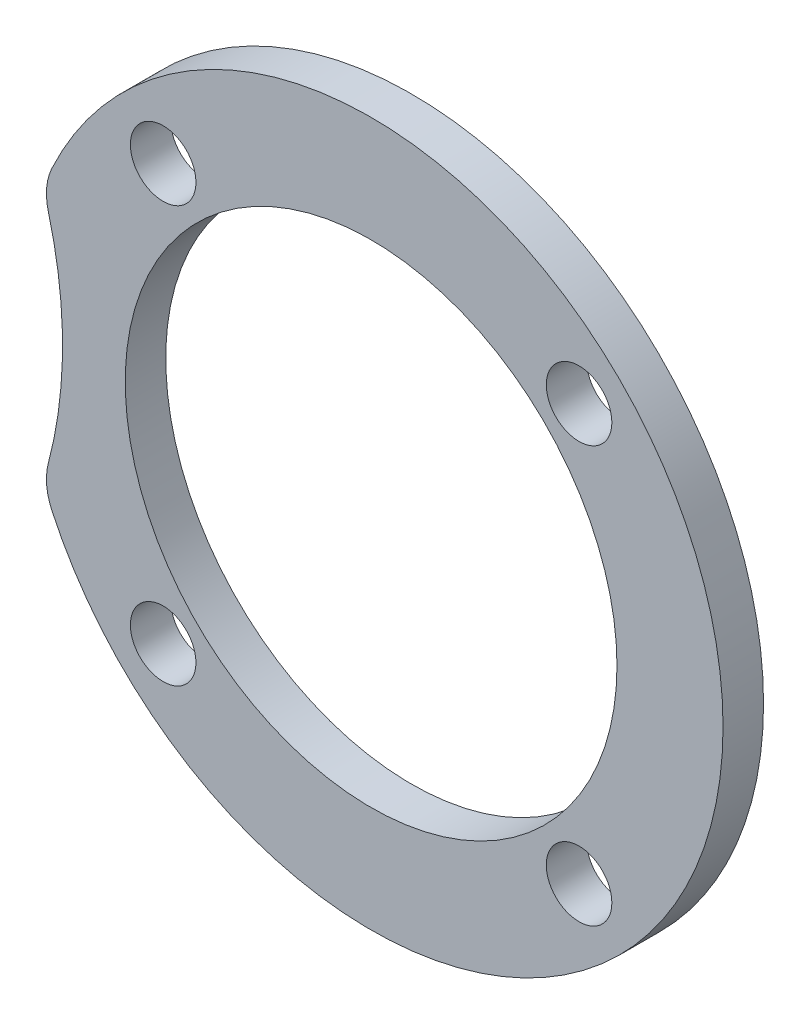
ISO-10303-21;
HEADER;
FILE_DESCRIPTION(('STEP AP214'),'2;1');
FILE_NAME('part.step','',(''),(''),'','','');
FILE_SCHEMA(('AUTOMOTIVE_DESIGN { 1 0 10303 214 1 1 1 1 }'));
ENDSEC;
DATA;
#1=APPLICATION_CONTEXT('core data for automotive mechanical design processes');
#2=APPLICATION_PROTOCOL_DEFINITION('international standard','automotive_design',2000,#1);
#3=PRODUCT_CONTEXT('',#1,'mechanical');
#4=PRODUCT('Part','Part','',(#3));
#5=PRODUCT_RELATED_PRODUCT_CATEGORY('part','',(#4));
#6=PRODUCT_DEFINITION_FORMATION('','',#4);
#7=PRODUCT_DEFINITION_CONTEXT('part definition',#1,'design');
#8=PRODUCT_DEFINITION('design','',#6,#7);
#9=PRODUCT_DEFINITION_SHAPE('','',#8);
#10=(LENGTH_UNIT() NAMED_UNIT(*) SI_UNIT(.MILLI.,.METRE.));
#11=(NAMED_UNIT(*) PLANE_ANGLE_UNIT() SI_UNIT($,.RADIAN.));
#12=(NAMED_UNIT(*) SI_UNIT($,.STERADIAN.) SOLID_ANGLE_UNIT());
#13=UNCERTAINTY_MEASURE_WITH_UNIT(LENGTH_MEASURE(1.E-05),#10,'distance_accuracy_value','');
#14=(GEOMETRIC_REPRESENTATION_CONTEXT(3) GLOBAL_UNCERTAINTY_ASSIGNED_CONTEXT((#13)) GLOBAL_UNIT_ASSIGNED_CONTEXT((#10,
#11,#12)) REPRESENTATION_CONTEXT('',''));
#15=CARTESIAN_POINT('',(0.,0.,0.));
#16=DIRECTION('',(0.,0.,1.));
#17=DIRECTION('',(1.,0.,0.));
#18=AXIS2_PLACEMENT_3D('',#15,#16,#17);
#19=CARTESIAN_POINT('',(0.,0.,1.05));
#20=DIRECTION('',(0.,0.,1.));
#21=DIRECTION('',(1.,0.,0.));
#22=AXIS2_PLACEMENT_3D('',#19,#20,#21);
#23=PLANE('',#22);
#24=CARTESIAN_POINT('',(-10.7833784130949,10.7833784130948,1.05));
#25=DIRECTION('',(0.,0.,1.));
#26=DIRECTION('',(1.,0.,0.));
#27=AXIS2_PLACEMENT_3D('',#24,#25,#26);
#28=CIRCLE('',#27,1.7);
#29=CARTESIAN_POINT('',(-9.08337841309492,10.7833784130948,1.05));
#30=VERTEX_POINT('',#29);
#31=EDGE_CURVE('E121',#30,#30,#28,.T.);
#32=ORIENTED_EDGE('',*,*,#31,.F.);
#33=EDGE_LOOP('',(#32));
#34=FACE_BOUND('',#33,.T.);
#35=CARTESIAN_POINT('',(-10.7833784130948,-10.7833784130949,1.05));
#36=DIRECTION('',(0.,0.,1.));
#37=DIRECTION('',(1.,0.,0.));
#38=AXIS2_PLACEMENT_3D('',#35,#36,#37);
#39=CIRCLE('',#38,1.7);
#40=CARTESIAN_POINT('',(-9.08337841309479,-10.7833784130949,1.05));
#41=VERTEX_POINT('',#40);
#42=EDGE_CURVE('E117',#41,#41,#39,.T.);
#43=ORIENTED_EDGE('',*,*,#42,.F.);
#44=EDGE_LOOP('',(#43));
#45=FACE_BOUND('',#44,.T.);
#46=CARTESIAN_POINT('',(10.7833784130949,-10.7833784130948,1.05));
#47=DIRECTION('',(0.,0.,1.));
#48=DIRECTION('',(1.,0.,0.));
#49=AXIS2_PLACEMENT_3D('',#46,#47,#48);
#50=CIRCLE('',#49,1.7);
#51=CARTESIAN_POINT('',(12.4833784130949,-10.7833784130948,1.05));
#52=VERTEX_POINT('',#51);
#53=EDGE_CURVE('E113',#52,#52,#50,.T.);
#54=ORIENTED_EDGE('',*,*,#53,.F.);
#55=EDGE_LOOP('',(#54));
#56=FACE_BOUND('',#55,.T.);
#57=CARTESIAN_POINT('',(10.7833784130948,10.7833784130949,1.05));
#58=DIRECTION('',(0.,0.,1.));
#59=DIRECTION('',(1.,0.,0.));
#60=AXIS2_PLACEMENT_3D('',#57,#58,#59);
#61=CIRCLE('',#60,1.7);
#62=CARTESIAN_POINT('',(12.4833784130948,10.7833784130949,1.05));
#63=VERTEX_POINT('',#62);
#64=EDGE_CURVE('E109',#63,#63,#61,.T.);
#65=ORIENTED_EDGE('',*,*,#64,.F.);
#66=EDGE_LOOP('',(#65));
#67=FACE_BOUND('',#66,.T.);
#68=CARTESIAN_POINT('',(-38.,0.,1.05));
#69=DIRECTION('',(0.,0.,1.));
#70=DIRECTION('',(1.,0.,0.));
#71=AXIS2_PLACEMENT_3D('',#68,#69,#70);
#72=CIRCLE('',#71,22.);
#73=CARTESIAN_POINT('',(-16.7359868421053,-5.64284896314614,1.05));
#74=VERTEX_POINT('',#73);
#75=CARTESIAN_POINT('',(-16.7359868421053,5.64284896314614,1.05));
#76=VERTEX_POINT('',#75);
#77=EDGE_CURVE('E128',#74,#76,#72,.T.);
#78=ORIENTED_EDGE('',*,*,#77,.F.);
#79=CARTESIAN_POINT('',(-13.8363486842105,-6.41232836721152,1.05));
#80=DIRECTION('',(0.,0.,1.));
#81=DIRECTION('',(1.,0.,0.));
#82=AXIS2_PLACEMENT_3D('',#79,#80,#81);
#83=CIRCLE('',#82,3.);
#84=CARTESIAN_POINT('',(-16.5582533433995,-7.67377001322035,1.05));
#85=VERTEX_POINT('',#84);
#86=EDGE_CURVE('E11',#74,#85,#83,.T.);
#87=ORIENTED_EDGE('',*,*,#86,.T.);
#88=CARTESIAN_POINT('',(0.,0.,1.05));
#89=DIRECTION('',(0.,0.,1.));
#90=DIRECTION('',(1.,0.,0.));
#91=AXIS2_PLACEMENT_3D('',#88,#89,#90);
#92=CIRCLE('',#91,18.25);
#93=CARTESIAN_POINT('',(-16.5582533433995,7.67377001322035,1.05));
#94=VERTEX_POINT('',#93);
#95=EDGE_CURVE('E92',#85,#94,#92,.T.);
#96=ORIENTED_EDGE('',*,*,#95,.T.);
#97=CARTESIAN_POINT('',(-13.8363486842105,6.41232836721152,1.05));
#98=DIRECTION('',(0.,0.,1.));
#99=DIRECTION('',(1.,0.,0.));
#100=AXIS2_PLACEMENT_3D('',#97,#98,#99);
#101=CIRCLE('',#100,3.);
#102=EDGE_CURVE('E43',#94,#76,#101,.T.);
#103=ORIENTED_EDGE('',*,*,#102,.T.);
#104=EDGE_LOOP('',(#78,#87,#96,#103));
#105=FACE_BOUND('',#104,.T.);
#106=CARTESIAN_POINT('',(0.,0.,1.05));
#107=DIRECTION('',(0.,0.,1.));
#108=DIRECTION('',(1.,0.,0.));
#109=AXIS2_PLACEMENT_3D('',#106,#107,#108);
#110=CIRCLE('',#109,12.75);
#111=CARTESIAN_POINT('',(12.75,0.,1.05));
#112=VERTEX_POINT('',#111);
#113=EDGE_CURVE('E98',#112,#112,#110,.T.);
#114=ORIENTED_EDGE('',*,*,#113,.F.);
#115=EDGE_LOOP('',(#114));
#116=FACE_BOUND('',#115,.T.);
#117=ADVANCED_FACE('F35',(#34,#45,#56,#67,#105,#116),#23,.T.);
#118=CARTESIAN_POINT('',(0.,0.,-1.05));
#119=DIRECTION('',(0.,0.,1.));
#120=DIRECTION('',(1.,0.,0.));
#121=AXIS2_PLACEMENT_3D('',#118,#119,#120);
#122=PLANE('',#121);
#123=CARTESIAN_POINT('',(-10.7833784130949,10.7833784130948,-1.05));
#124=DIRECTION('',(0.,0.,1.));
#125=DIRECTION('',(1.,0.,0.));
#126=AXIS2_PLACEMENT_3D('',#123,#124,#125);
#127=CIRCLE('',#126,1.7);
#128=CARTESIAN_POINT('',(-9.08337841309492,10.7833784130948,-1.05));
#129=VERTEX_POINT('',#128);
#130=EDGE_CURVE('E118',#129,#129,#127,.T.);
#131=ORIENTED_EDGE('',*,*,#130,.T.);
#132=EDGE_LOOP('',(#131));
#133=FACE_BOUND('',#132,.T.);
#134=CARTESIAN_POINT('',(-10.7833784130948,-10.7833784130949,-1.05));
#135=DIRECTION('',(0.,0.,1.));
#136=DIRECTION('',(1.,0.,0.));
#137=AXIS2_PLACEMENT_3D('',#134,#135,#136);
#138=CIRCLE('',#137,1.7);
#139=CARTESIAN_POINT('',(-9.08337841309479,-10.7833784130949,-1.05));
#140=VERTEX_POINT('',#139);
#141=EDGE_CURVE('E114',#140,#140,#138,.T.);
#142=ORIENTED_EDGE('',*,*,#141,.T.);
#143=EDGE_LOOP('',(#142));
#144=FACE_BOUND('',#143,.T.);
#145=CARTESIAN_POINT('',(10.7833784130949,-10.7833784130948,-1.05));
#146=DIRECTION('',(0.,0.,1.));
#147=DIRECTION('',(1.,0.,0.));
#148=AXIS2_PLACEMENT_3D('',#145,#146,#147);
#149=CIRCLE('',#148,1.7);
#150=CARTESIAN_POINT('',(12.4833784130949,-10.7833784130948,-1.05));
#151=VERTEX_POINT('',#150);
#152=EDGE_CURVE('E110',#151,#151,#149,.T.);
#153=ORIENTED_EDGE('',*,*,#152,.T.);
#154=EDGE_LOOP('',(#153));
#155=FACE_BOUND('',#154,.T.);
#156=CARTESIAN_POINT('',(10.7833784130948,10.7833784130949,-1.05));
#157=DIRECTION('',(0.,0.,1.));
#158=DIRECTION('',(1.,0.,0.));
#159=AXIS2_PLACEMENT_3D('',#156,#157,#158);
#160=CIRCLE('',#159,1.7);
#161=CARTESIAN_POINT('',(12.4833784130948,10.7833784130949,-1.05));
#162=VERTEX_POINT('',#161);
#163=EDGE_CURVE('E106',#162,#162,#160,.T.);
#164=ORIENTED_EDGE('',*,*,#163,.T.);
#165=EDGE_LOOP('',(#164));
#166=FACE_BOUND('',#165,.T.);
#167=CARTESIAN_POINT('',(0.,0.,-1.05));
#168=DIRECTION('',(0.,0.,1.));
#169=DIRECTION('',(1.,0.,0.));
#170=AXIS2_PLACEMENT_3D('',#167,#168,#169);
#171=CIRCLE('',#170,18.25);
#172=CARTESIAN_POINT('',(-16.5582533433995,-7.67377001322035,-1.05));
#173=VERTEX_POINT('',#172);
#174=CARTESIAN_POINT('',(-16.5582533433995,7.67377001322035,-1.05));
#175=VERTEX_POINT('',#174);
#176=EDGE_CURVE('E90',#173,#175,#171,.T.);
#177=ORIENTED_EDGE('',*,*,#176,.F.);
#178=CARTESIAN_POINT('',(-13.8363486842105,-6.41232836721152,-1.05));
#179=DIRECTION('',(0.,0.,1.));
#180=DIRECTION('',(1.,0.,0.));
#181=AXIS2_PLACEMENT_3D('',#178,#179,#180);
#182=CIRCLE('',#181,3.);
#183=CARTESIAN_POINT('',(-16.7359868421053,-5.64284896314614,-1.05));
#184=VERTEX_POINT('',#183);
#185=EDGE_CURVE('E74',#173,#184,#182,.F.);
#186=ORIENTED_EDGE('',*,*,#185,.T.);
#187=CARTESIAN_POINT('',(-38.,0.,-1.05));
#188=DIRECTION('',(0.,0.,1.));
#189=DIRECTION('',(1.,0.,0.));
#190=AXIS2_PLACEMENT_3D('',#187,#188,#189);
#191=CIRCLE('',#190,22.);
#192=CARTESIAN_POINT('',(-16.7359868421053,5.64284896314614,-1.05));
#193=VERTEX_POINT('',#192);
#194=EDGE_CURVE('E127',#184,#193,#191,.T.);
#195=ORIENTED_EDGE('',*,*,#194,.T.);
#196=CARTESIAN_POINT('',(-13.8363486842105,6.41232836721152,-1.05));
#197=DIRECTION('',(0.,0.,1.));
#198=DIRECTION('',(1.,0.,0.));
#199=AXIS2_PLACEMENT_3D('',#196,#197,#198);
#200=CIRCLE('',#199,3.);
#201=EDGE_CURVE('E83',#193,#175,#200,.F.);
#202=ORIENTED_EDGE('',*,*,#201,.T.);
#203=EDGE_LOOP('',(#177,#186,#195,#202));
#204=FACE_BOUND('',#203,.T.);
#205=CARTESIAN_POINT('',(0.,0.,-1.05));
#206=DIRECTION('',(0.,0.,1.));
#207=DIRECTION('',(1.,0.,0.));
#208=AXIS2_PLACEMENT_3D('',#205,#206,#207);
#209=CIRCLE('',#208,12.75);
#210=CARTESIAN_POINT('',(12.75,0.,-1.05));
#211=VERTEX_POINT('',#210);
#212=EDGE_CURVE('E102',#211,#211,#209,.T.);
#213=ORIENTED_EDGE('',*,*,#212,.T.);
#214=EDGE_LOOP('',(#213));
#215=FACE_BOUND('',#214,.T.);
#216=ADVANCED_FACE('F95',(#133,#144,#155,#166,#204,#215),#122,.F.);
#217=CARTESIAN_POINT('',(0.,0.,1.05));
#218=DIRECTION('',(0.,0.,-1.));
#219=DIRECTION('',(-1.,0.,0.));
#220=AXIS2_PLACEMENT_3D('',#217,#218,#219);
#221=CYLINDRICAL_SURFACE('',#220,18.25);
#222=ORIENTED_EDGE('',*,*,#95,.F.);
#223=DIRECTION('',(0.,0.,-1.));
#224=VECTOR('',#223,1.);
#225=CARTESIAN_POINT('',(-16.5582533433995,-7.67377001322035,1.05));
#226=LINE('',#225,#224);
#227=EDGE_CURVE('E78',#85,#173,#226,.T.);
#228=ORIENTED_EDGE('',*,*,#227,.T.);
#229=ORIENTED_EDGE('',*,*,#176,.T.);
#230=DIRECTION('',(0.,0.,-1.));
#231=VECTOR('',#230,1.);
#232=CARTESIAN_POINT('',(-16.5582533433995,7.67377001322035,1.05));
#233=LINE('',#232,#231);
#234=EDGE_CURVE('E93',#175,#94,#233,.F.);
#235=ORIENTED_EDGE('',*,*,#234,.T.);
#236=EDGE_LOOP('',(#222,#228,#229,#235));
#237=FACE_BOUND('',#236,.T.);
#238=ADVANCED_FACE('F88',(#237),#221,.T.);
#239=CARTESIAN_POINT('',(0.,0.,1.05));
#240=DIRECTION('',(0.,0.,-1.));
#241=DIRECTION('',(-1.,0.,0.));
#242=AXIS2_PLACEMENT_3D('',#239,#240,#241);
#243=CYLINDRICAL_SURFACE('',#242,12.75);
#244=ORIENTED_EDGE('',*,*,#113,.T.);
#245=EDGE_LOOP('',(#244));
#246=FACE_BOUND('',#245,.T.);
#247=ORIENTED_EDGE('',*,*,#212,.F.);
#248=EDGE_LOOP('',(#247));
#249=FACE_BOUND('',#248,.T.);
#250=ADVANCED_FACE('F158',(#246,#249),#243,.F.);
#251=CARTESIAN_POINT('',(-38.,0.,-20.));
#252=DIRECTION('',(0.,0.,1.));
#253=DIRECTION('',(1.,0.,0.));
#254=AXIS2_PLACEMENT_3D('',#251,#252,#253);
#255=CYLINDRICAL_SURFACE('',#254,22.);
#256=ORIENTED_EDGE('',*,*,#194,.F.);
#257=DIRECTION('',(0.,0.,1.));
#258=VECTOR('',#257,1.);
#259=CARTESIAN_POINT('',(-16.7359868421053,-5.64284896314614,-20.));
#260=LINE('',#259,#258);
#261=EDGE_CURVE('E56',#184,#74,#260,.T.);
#262=ORIENTED_EDGE('',*,*,#261,.T.);
#263=ORIENTED_EDGE('',*,*,#77,.T.);
#264=DIRECTION('',(0.,0.,1.));
#265=VECTOR('',#264,1.);
#266=CARTESIAN_POINT('',(-16.7359868421053,5.64284896314614,-20.));
#267=LINE('',#266,#265);
#268=EDGE_CURVE('E82',#76,#193,#267,.F.);
#269=ORIENTED_EDGE('',*,*,#268,.T.);
#270=EDGE_LOOP('',(#256,#262,#263,#269));
#271=FACE_BOUND('',#270,.T.);
#272=ADVANCED_FACE('F126',(#271),#255,.F.);
#273=CARTESIAN_POINT('',(10.7833784130948,10.7833784130949,-15.));
#274=DIRECTION('',(0.,0.,1.));
#275=DIRECTION('',(1.,0.,0.));
#276=AXIS2_PLACEMENT_3D('',#273,#274,#275);
#277=CYLINDRICAL_SURFACE('',#276,1.7);
#278=ORIENTED_EDGE('',*,*,#64,.T.);
#279=EDGE_LOOP('',(#278));
#280=FACE_BOUND('',#279,.T.);
#281=ORIENTED_EDGE('',*,*,#163,.F.);
#282=EDGE_LOOP('',(#281));
#283=FACE_BOUND('',#282,.T.);
#284=ADVANCED_FACE('F144',(#280,#283),#277,.F.);
#285=CARTESIAN_POINT('',(10.7833784130949,-10.7833784130948,-15.));
#286=DIRECTION('',(0.,0.,1.));
#287=DIRECTION('',(1.,0.,0.));
#288=AXIS2_PLACEMENT_3D('',#285,#286,#287);
#289=CYLINDRICAL_SURFACE('',#288,1.7);
#290=ORIENTED_EDGE('',*,*,#53,.T.);
#291=EDGE_LOOP('',(#290));
#292=FACE_BOUND('',#291,.T.);
#293=ORIENTED_EDGE('',*,*,#152,.F.);
#294=EDGE_LOOP('',(#293));
#295=FACE_BOUND('',#294,.T.);
#296=ADVANCED_FACE('F174',(#292,#295),#289,.F.);
#297=CARTESIAN_POINT('',(-10.7833784130948,-10.7833784130949,-15.));
#298=DIRECTION('',(0.,0.,1.));
#299=DIRECTION('',(1.,0.,0.));
#300=AXIS2_PLACEMENT_3D('',#297,#298,#299);
#301=CYLINDRICAL_SURFACE('',#300,1.7);
#302=ORIENTED_EDGE('',*,*,#42,.T.);
#303=EDGE_LOOP('',(#302));
#304=FACE_BOUND('',#303,.T.);
#305=ORIENTED_EDGE('',*,*,#141,.F.);
#306=EDGE_LOOP('',(#305));
#307=FACE_BOUND('',#306,.T.);
#308=ADVANCED_FACE('F168',(#304,#307),#301,.F.);
#309=CARTESIAN_POINT('',(-10.7833784130949,10.7833784130948,-15.));
#310=DIRECTION('',(0.,0.,1.));
#311=DIRECTION('',(1.,0.,0.));
#312=AXIS2_PLACEMENT_3D('',#309,#310,#311);
#313=CYLINDRICAL_SURFACE('',#312,1.7);
#314=ORIENTED_EDGE('',*,*,#31,.T.);
#315=EDGE_LOOP('',(#314));
#316=FACE_BOUND('',#315,.T.);
#317=ORIENTED_EDGE('',*,*,#130,.F.);
#318=EDGE_LOOP('',(#317));
#319=FACE_BOUND('',#318,.T.);
#320=ADVANCED_FACE('F163',(#316,#319),#313,.F.);
#321=CARTESIAN_POINT('',(-13.8363486842105,-6.41232836721152,-20.));
#322=DIRECTION('',(0.,0.,1.));
#323=DIRECTION('',(1.,0.,0.));
#324=AXIS2_PLACEMENT_3D('',#321,#322,#323);
#325=CYLINDRICAL_SURFACE('',#324,3.);
#326=ORIENTED_EDGE('',*,*,#86,.F.);
#327=ORIENTED_EDGE('',*,*,#261,.F.);
#328=ORIENTED_EDGE('',*,*,#185,.F.);
#329=ORIENTED_EDGE('',*,*,#227,.F.);
#330=EDGE_LOOP('',(#326,#327,#328,#329));
#331=FACE_BOUND('',#330,.T.);
#332=ADVANCED_FACE('F77',(#331),#325,.T.);
#333=CARTESIAN_POINT('',(-13.8363486842105,6.41232836721152,-20.));
#334=DIRECTION('',(0.,0.,-1.));
#335=DIRECTION('',(-1.,0.,0.));
#336=AXIS2_PLACEMENT_3D('',#333,#334,#335);
#337=CYLINDRICAL_SURFACE('',#336,3.);
#338=ORIENTED_EDGE('',*,*,#201,.F.);
#339=ORIENTED_EDGE('',*,*,#268,.F.);
#340=ORIENTED_EDGE('',*,*,#102,.F.);
#341=ORIENTED_EDGE('',*,*,#234,.F.);
#342=EDGE_LOOP('',(#338,#339,#340,#341));
#343=FACE_BOUND('',#342,.T.);
#344=ADVANCED_FACE('F37',(#343),#337,.T.);
#345=CLOSED_SHELL('',(#117,#216,#238,#250,#272,#284,#296,#308,#320,#332,#344));
#346=MANIFOLD_SOLID_BREP('B2',#345);
#347=ADVANCED_BREP_SHAPE_REPRESENTATION('',(#18,#346),#14);
#348=SHAPE_DEFINITION_REPRESENTATION(#9,#347);
ENDSEC;
END-ISO-10303-21;
